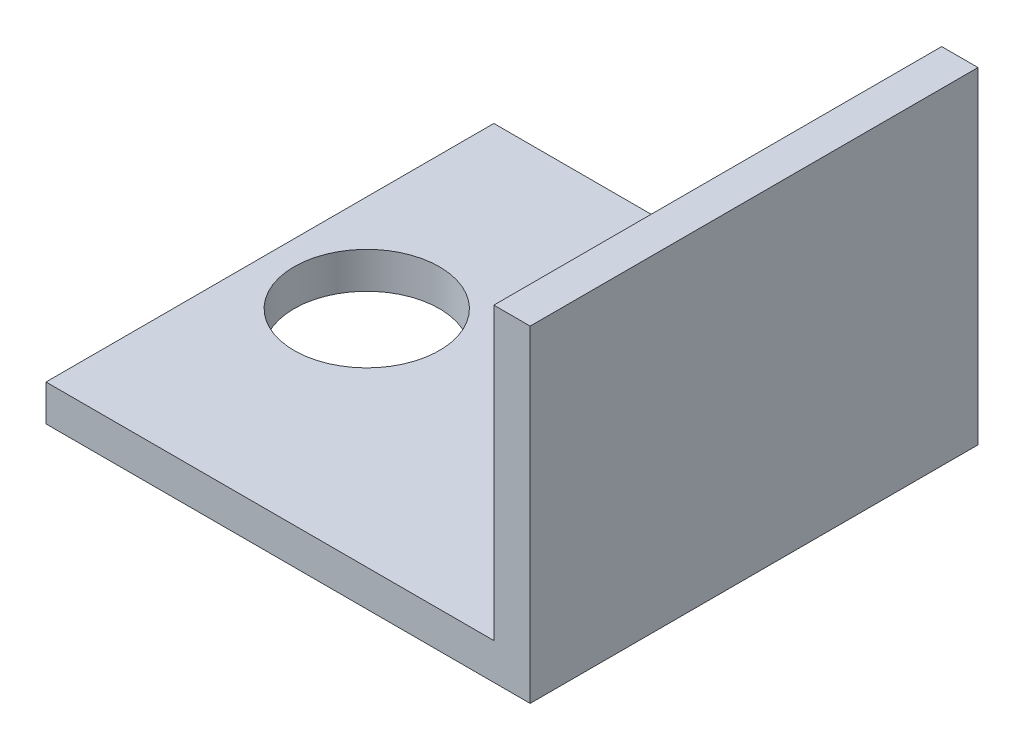
ISO-10303-21;
HEADER;
FILE_DESCRIPTION(('STEP AP214'),'2;1');
FILE_NAME('part.step','',(''),(''),'','','');
FILE_SCHEMA(('AUTOMOTIVE_DESIGN { 1 0 10303 214 1 1 1 1 }'));
ENDSEC;
DATA;
#1=APPLICATION_CONTEXT('core data for automotive mechanical design processes');
#2=APPLICATION_PROTOCOL_DEFINITION('international standard','automotive_design',2000,#1);
#3=PRODUCT_CONTEXT('',#1,'mechanical');
#4=PRODUCT('Part','Part','',(#3));
#5=PRODUCT_RELATED_PRODUCT_CATEGORY('part','',(#4));
#6=PRODUCT_DEFINITION_FORMATION('','',#4);
#7=PRODUCT_DEFINITION_CONTEXT('part definition',#1,'design');
#8=PRODUCT_DEFINITION('design','',#6,#7);
#9=PRODUCT_DEFINITION_SHAPE('','',#8);
#10=(LENGTH_UNIT() NAMED_UNIT(*) SI_UNIT(.MILLI.,.METRE.));
#11=(NAMED_UNIT(*) PLANE_ANGLE_UNIT() SI_UNIT($,.RADIAN.));
#12=(NAMED_UNIT(*) SI_UNIT($,.STERADIAN.) SOLID_ANGLE_UNIT());
#13=UNCERTAINTY_MEASURE_WITH_UNIT(LENGTH_MEASURE(1.E-05),#10,'distance_accuracy_value','');
#14=(GEOMETRIC_REPRESENTATION_CONTEXT(3) GLOBAL_UNCERTAINTY_ASSIGNED_CONTEXT((#13)) GLOBAL_UNIT_ASSIGNED_CONTEXT((#10,
#11,#12)) REPRESENTATION_CONTEXT('',''));
#15=CARTESIAN_POINT('',(0.,0.,0.));
#16=DIRECTION('',(0.,0.,1.));
#17=DIRECTION('',(1.,0.,0.));
#18=AXIS2_PLACEMENT_3D('',#15,#16,#17);
#19=CARTESIAN_POINT('',(-3.,0.,37.));
#20=DIRECTION('',(0.,-1.,0.));
#21=DIRECTION('',(0.,0.,-1.));
#22=AXIS2_PLACEMENT_3D('',#19,#20,#21);
#23=PLANE('',#22);
#24=DIRECTION('',(-1.,0.,0.));
#25=VECTOR('',#24,1.);
#26=CARTESIAN_POINT('',(-3.,0.,0.));
#27=LINE('',#26,#25);
#28=CARTESIAN_POINT('',(0.,0.,0.));
#29=VERTEX_POINT('',#28);
#30=CARTESIAN_POINT('',(-3.,0.,0.));
#31=VERTEX_POINT('',#30);
#32=EDGE_CURVE('E119',#29,#31,#27,.T.);
#33=ORIENTED_EDGE('',*,*,#32,.T.);
#34=DIRECTION('',(0.,0.,-1.));
#35=VECTOR('',#34,1.);
#36=CARTESIAN_POINT('',(-3.,0.,37.));
#37=LINE('',#36,#35);
#38=CARTESIAN_POINT('',(-3.,0.,37.));
#39=VERTEX_POINT('',#38);
#40=EDGE_CURVE('E11',#39,#31,#37,.T.);
#41=ORIENTED_EDGE('',*,*,#40,.F.);
#42=DIRECTION('',(-1.,0.,0.));
#43=VECTOR('',#42,1.);
#44=CARTESIAN_POINT('',(-3.,0.,37.));
#45=LINE('',#44,#43);
#46=CARTESIAN_POINT('',(0.,0.,37.));
#47=VERTEX_POINT('',#46);
#48=EDGE_CURVE('E129',#47,#39,#45,.T.);
#49=ORIENTED_EDGE('',*,*,#48,.F.);
#50=DIRECTION('',(0.,0.,-1.));
#51=VECTOR('',#50,1.);
#52=CARTESIAN_POINT('',(0.,0.,37.));
#53=LINE('',#52,#51);
#54=EDGE_CURVE('E115',#47,#29,#53,.T.);
#55=ORIENTED_EDGE('',*,*,#54,.T.);
#56=EDGE_LOOP('',(#33,#41,#49,#55));
#57=FACE_BOUND('',#56,.T.);
#58=ADVANCED_FACE('F34',(#57),#23,.F.);
#59=CARTESIAN_POINT('',(-3.,-24.,37.));
#60=DIRECTION('',(1.,0.,0.));
#61=DIRECTION('',(0.,1.,0.));
#62=AXIS2_PLACEMENT_3D('',#59,#60,#61);
#63=PLANE('',#62);
#64=DIRECTION('',(0.,-1.,0.));
#65=VECTOR('',#64,1.);
#66=CARTESIAN_POINT('',(-3.,-24.,0.));
#67=LINE('',#66,#65);
#68=CARTESIAN_POINT('',(-3.,-24.,0.));
#69=VERTEX_POINT('',#68);
#70=EDGE_CURVE('E122',#31,#69,#67,.T.);
#71=ORIENTED_EDGE('',*,*,#70,.T.);
#72=DIRECTION('',(0.,0.,-1.));
#73=VECTOR('',#72,1.);
#74=CARTESIAN_POINT('',(-3.,-24.,37.));
#75=LINE('',#74,#73);
#76=CARTESIAN_POINT('',(-3.,-24.,37.));
#77=VERTEX_POINT('',#76);
#78=EDGE_CURVE('E43',#77,#69,#75,.T.);
#79=ORIENTED_EDGE('',*,*,#78,.F.);
#80=DIRECTION('',(0.,-1.,0.));
#81=VECTOR('',#80,1.);
#82=CARTESIAN_POINT('',(-3.,-24.,37.));
#83=LINE('',#82,#81);
#84=EDGE_CURVE('E88',#39,#77,#83,.T.);
#85=ORIENTED_EDGE('',*,*,#84,.F.);
#86=ORIENTED_EDGE('',*,*,#40,.T.);
#87=EDGE_LOOP('',(#71,#79,#85,#86));
#88=FACE_BOUND('',#87,.T.);
#89=ADVANCED_FACE('F156',(#88),#63,.F.);
#90=CARTESIAN_POINT('',(-40.,-24.,37.));
#91=DIRECTION('',(0.,-1.,0.));
#92=DIRECTION('',(1.,0.,0.));
#93=AXIS2_PLACEMENT_3D('',#90,#91,#92);
#94=PLANE('',#93);
#95=CARTESIAN_POINT('',(-32.,-24.,18.5));
#96=DIRECTION('',(0.,1.,0.));
#97=DIRECTION('',(-1.,0.,0.));
#98=AXIS2_PLACEMENT_3D('',#95,#96,#97);
#99=CIRCLE('',#98,6.);
#100=CARTESIAN_POINT('',(-38.,-24.,18.5));
#101=VERTEX_POINT('',#100);
#102=EDGE_CURVE('E210',#101,#101,#99,.T.);
#103=ORIENTED_EDGE('',*,*,#102,.F.);
#104=EDGE_LOOP('',(#103));
#105=FACE_BOUND('',#104,.T.);
#106=DIRECTION('',(-1.,0.,0.));
#107=VECTOR('',#106,1.);
#108=CARTESIAN_POINT('',(-40.,-24.,0.));
#109=LINE('',#108,#107);
#110=CARTESIAN_POINT('',(-40.,-24.,0.));
#111=VERTEX_POINT('',#110);
#112=EDGE_CURVE('E124',#69,#111,#109,.T.);
#113=ORIENTED_EDGE('',*,*,#112,.T.);
#114=DIRECTION('',(0.,0.,-1.));
#115=VECTOR('',#114,1.);
#116=CARTESIAN_POINT('',(-40.,-24.,37.));
#117=LINE('',#116,#115);
#118=CARTESIAN_POINT('',(-40.,-24.,37.));
#119=VERTEX_POINT('',#118);
#120=EDGE_CURVE('E110',#119,#111,#117,.T.);
#121=ORIENTED_EDGE('',*,*,#120,.F.);
#122=DIRECTION('',(-1.,0.,0.));
#123=VECTOR('',#122,1.);
#124=CARTESIAN_POINT('',(-40.,-24.,37.));
#125=LINE('',#124,#123);
#126=EDGE_CURVE('E101',#77,#119,#125,.T.);
#127=ORIENTED_EDGE('',*,*,#126,.F.);
#128=ORIENTED_EDGE('',*,*,#78,.T.);
#129=EDGE_LOOP('',(#113,#121,#127,#128));
#130=FACE_BOUND('',#129,.T.);
#131=ADVANCED_FACE('F136',(#105,#130),#94,.F.);
#132=CARTESIAN_POINT('',(-40.,-27.,37.));
#133=DIRECTION('',(1.,0.,0.));
#134=DIRECTION('',(0.,1.,0.));
#135=AXIS2_PLACEMENT_3D('',#132,#133,#134);
#136=PLANE('',#135);
#137=DIRECTION('',(0.,-1.,0.));
#138=VECTOR('',#137,1.);
#139=CARTESIAN_POINT('',(-40.,-27.,0.));
#140=LINE('',#139,#138);
#141=CARTESIAN_POINT('',(-40.,-27.,0.));
#142=VERTEX_POINT('',#141);
#143=EDGE_CURVE('E109',#111,#142,#140,.T.);
#144=ORIENTED_EDGE('',*,*,#143,.T.);
#145=DIRECTION('',(0.,0.,-1.));
#146=VECTOR('',#145,1.);
#147=CARTESIAN_POINT('',(-40.,-27.,37.));
#148=LINE('',#147,#146);
#149=CARTESIAN_POINT('',(-40.,-27.,37.));
#150=VERTEX_POINT('',#149);
#151=EDGE_CURVE('E106',#150,#142,#148,.T.);
#152=ORIENTED_EDGE('',*,*,#151,.F.);
#153=DIRECTION('',(0.,-1.,0.));
#154=VECTOR('',#153,1.);
#155=CARTESIAN_POINT('',(-40.,-27.,37.));
#156=LINE('',#155,#154);
#157=EDGE_CURVE('E95',#119,#150,#156,.T.);
#158=ORIENTED_EDGE('',*,*,#157,.F.);
#159=ORIENTED_EDGE('',*,*,#120,.T.);
#160=EDGE_LOOP('',(#144,#152,#158,#159));
#161=FACE_BOUND('',#160,.T.);
#162=ADVANCED_FACE('F107',(#161),#136,.F.);
#163=CARTESIAN_POINT('',(0.,-27.,37.));
#164=DIRECTION('',(0.,1.,0.));
#165=DIRECTION('',(-1.,0.,0.));
#166=AXIS2_PLACEMENT_3D('',#163,#164,#165);
#167=PLANE('',#166);
#168=CARTESIAN_POINT('',(-32.,-27.,18.5));
#169=DIRECTION('',(0.,1.,0.));
#170=DIRECTION('',(-1.,0.,0.));
#171=AXIS2_PLACEMENT_3D('',#168,#169,#170);
#172=CIRCLE('',#171,6.);
#173=CARTESIAN_POINT('',(-38.,-27.,18.5));
#174=VERTEX_POINT('',#173);
#175=EDGE_CURVE('E37',#174,#174,#172,.T.);
#176=ORIENTED_EDGE('',*,*,#175,.T.);
#177=EDGE_LOOP('',(#176));
#178=FACE_BOUND('',#177,.T.);
#179=DIRECTION('',(1.,0.,0.));
#180=VECTOR('',#179,1.);
#181=CARTESIAN_POINT('',(0.,-27.,0.));
#182=LINE('',#181,#180);
#183=CARTESIAN_POINT('',(0.,-27.,0.));
#184=VERTEX_POINT('',#183);
#185=EDGE_CURVE('E74',#142,#184,#182,.T.);
#186=ORIENTED_EDGE('',*,*,#185,.T.);
#187=DIRECTION('',(0.,0.,-1.));
#188=VECTOR('',#187,1.);
#189=CARTESIAN_POINT('',(0.,-27.,37.));
#190=LINE('',#189,#188);
#191=CARTESIAN_POINT('',(0.,-27.,37.));
#192=VERTEX_POINT('',#191);
#193=EDGE_CURVE('E111',#192,#184,#190,.T.);
#194=ORIENTED_EDGE('',*,*,#193,.F.);
#195=DIRECTION('',(1.,0.,0.));
#196=VECTOR('',#195,1.);
#197=CARTESIAN_POINT('',(0.,-27.,37.));
#198=LINE('',#197,#196);
#199=EDGE_CURVE('E99',#150,#192,#198,.T.);
#200=ORIENTED_EDGE('',*,*,#199,.F.);
#201=ORIENTED_EDGE('',*,*,#151,.T.);
#202=EDGE_LOOP('',(#186,#194,#200,#201));
#203=FACE_BOUND('',#202,.T.);
#204=ADVANCED_FACE('F113',(#178,#203),#167,.F.);
#205=CARTESIAN_POINT('',(0.,0.,37.));
#206=DIRECTION('',(-1.,0.,0.));
#207=DIRECTION('',(0.,-1.,0.));
#208=AXIS2_PLACEMENT_3D('',#205,#206,#207);
#209=PLANE('',#208);
#210=DIRECTION('',(0.,1.,0.));
#211=VECTOR('',#210,1.);
#212=CARTESIAN_POINT('',(0.,0.,0.));
#213=LINE('',#212,#211);
#214=EDGE_CURVE('E80',#184,#29,#213,.T.);
#215=ORIENTED_EDGE('',*,*,#214,.T.);
#216=ORIENTED_EDGE('',*,*,#54,.F.);
#217=DIRECTION('',(0.,1.,0.));
#218=VECTOR('',#217,1.);
#219=CARTESIAN_POINT('',(0.,0.,37.));
#220=LINE('',#219,#218);
#221=EDGE_CURVE('E51',#192,#47,#220,.T.);
#222=ORIENTED_EDGE('',*,*,#221,.F.);
#223=ORIENTED_EDGE('',*,*,#193,.T.);
#224=EDGE_LOOP('',(#215,#216,#222,#223));
#225=FACE_BOUND('',#224,.T.);
#226=ADVANCED_FACE('F143',(#225),#209,.F.);
#227=CARTESIAN_POINT('',(0.,0.,37.));
#228=DIRECTION('',(0.,0.,-1.));
#229=DIRECTION('',(-1.,0.,0.));
#230=AXIS2_PLACEMENT_3D('',#227,#228,#229);
#231=PLANE('',#230);
#232=ORIENTED_EDGE('',*,*,#48,.T.);
#233=ORIENTED_EDGE('',*,*,#84,.T.);
#234=ORIENTED_EDGE('',*,*,#126,.T.);
#235=ORIENTED_EDGE('',*,*,#157,.T.);
#236=ORIENTED_EDGE('',*,*,#199,.T.);
#237=ORIENTED_EDGE('',*,*,#221,.T.);
#238=EDGE_LOOP('',(#232,#233,#234,#235,#236,#237));
#239=FACE_BOUND('',#238,.T.);
#240=ADVANCED_FACE('F97',(#239),#231,.F.);
#241=CARTESIAN_POINT('',(0.,0.,0.));
#242=DIRECTION('',(0.,0.,-1.));
#243=DIRECTION('',(-1.,0.,0.));
#244=AXIS2_PLACEMENT_3D('',#241,#242,#243);
#245=PLANE('',#244);
#246=ORIENTED_EDGE('',*,*,#32,.F.);
#247=ORIENTED_EDGE('',*,*,#214,.F.);
#248=ORIENTED_EDGE('',*,*,#185,.F.);
#249=ORIENTED_EDGE('',*,*,#143,.F.);
#250=ORIENTED_EDGE('',*,*,#112,.F.);
#251=ORIENTED_EDGE('',*,*,#70,.F.);
#252=EDGE_LOOP('',(#246,#247,#248,#249,#250,#251));
#253=FACE_BOUND('',#252,.T.);
#254=ADVANCED_FACE('F139',(#253),#245,.T.);
#255=CARTESIAN_POINT('',(-32.,-59.,18.5));
#256=DIRECTION('',(0.,1.,0.));
#257=DIRECTION('',(-1.,0.,0.));
#258=AXIS2_PLACEMENT_3D('',#255,#256,#257);
#259=CYLINDRICAL_SURFACE('',#258,6.);
#260=ORIENTED_EDGE('',*,*,#102,.T.);
#261=EDGE_LOOP('',(#260));
#262=FACE_BOUND('',#261,.T.);
#263=ORIENTED_EDGE('',*,*,#175,.F.);
#264=EDGE_LOOP('',(#263));
#265=FACE_BOUND('',#264,.T.);
#266=ADVANCED_FACE('F183',(#262,#265),#259,.F.);
#267=CLOSED_SHELL('',(#58,#89,#131,#162,#204,#226,#240,#254,#266));
#268=MANIFOLD_SOLID_BREP('B2',#267);
#269=ADVANCED_BREP_SHAPE_REPRESENTATION('',(#18,#268),#14);
#270=SHAPE_DEFINITION_REPRESENTATION(#9,#269);
ENDSEC;
END-ISO-10303-21;
